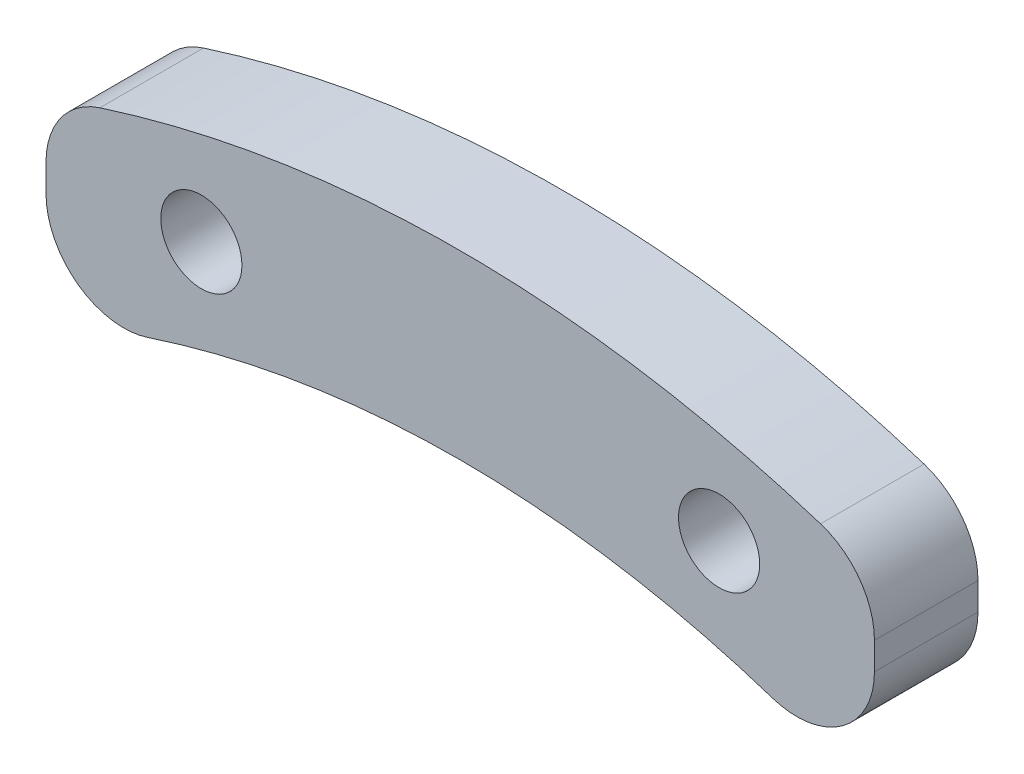
ISO-10303-21;
HEADER;
FILE_DESCRIPTION(('STEP AP214'),'2;1');
FILE_NAME('part.step','',(''),(''),'','','');
FILE_SCHEMA(('AUTOMOTIVE_DESIGN { 1 0 10303 214 1 1 1 1 }'));
ENDSEC;
DATA;
#1=APPLICATION_CONTEXT('core data for automotive mechanical design processes');
#2=APPLICATION_PROTOCOL_DEFINITION('international standard','automotive_design',2000,#1);
#3=PRODUCT_CONTEXT('',#1,'mechanical');
#4=PRODUCT('Part','Part','',(#3));
#5=PRODUCT_RELATED_PRODUCT_CATEGORY('part','',(#4));
#6=PRODUCT_DEFINITION_FORMATION('','',#4);
#7=PRODUCT_DEFINITION_CONTEXT('part definition',#1,'design');
#8=PRODUCT_DEFINITION('design','',#6,#7);
#9=PRODUCT_DEFINITION_SHAPE('','',#8);
#10=(LENGTH_UNIT() NAMED_UNIT(*) SI_UNIT(.MILLI.,.METRE.));
#11=(NAMED_UNIT(*) PLANE_ANGLE_UNIT() SI_UNIT($,.RADIAN.));
#12=(NAMED_UNIT(*) SI_UNIT($,.STERADIAN.) SOLID_ANGLE_UNIT());
#13=UNCERTAINTY_MEASURE_WITH_UNIT(LENGTH_MEASURE(1.E-05),#10,'distance_accuracy_value','');
#14=(GEOMETRIC_REPRESENTATION_CONTEXT(3) GLOBAL_UNCERTAINTY_ASSIGNED_CONTEXT((#13)) GLOBAL_UNIT_ASSIGNED_CONTEXT((#10,
#11,#12)) REPRESENTATION_CONTEXT('',''));
#15=CARTESIAN_POINT('',(0.,0.,0.));
#16=DIRECTION('',(0.,0.,1.));
#17=DIRECTION('',(1.,0.,0.));
#18=AXIS2_PLACEMENT_3D('',#15,#16,#17);
#19=CARTESIAN_POINT('',(0.,0.,3.175));
#20=DIRECTION('',(0.,0.,1.));
#21=DIRECTION('',(1.,0.,0.));
#22=AXIS2_PLACEMENT_3D('',#19,#20,#21);
#23=PLANE('',#22);
#24=CARTESIAN_POINT('',(15.875,64.7575478226284,3.175));
#25=DIRECTION('',(0.,0.,1.));
#26=DIRECTION('',(1.,0.,0.));
#27=AXIS2_PLACEMENT_3D('',#24,#25,#26);
#28=CIRCLE('',#27,2.4892);
#29=CARTESIAN_POINT('',(18.3642,64.7575478226284,3.175));
#30=VERTEX_POINT('',#29);
#31=EDGE_CURVE('E128',#30,#30,#28,.T.);
#32=ORIENTED_EDGE('',*,*,#31,.F.);
#33=EDGE_LOOP('',(#32));
#34=FACE_BOUND('',#33,.T.);
#35=DIRECTION('',(0.,-1.,0.));
#36=VECTOR('',#35,1.);
#37=CARTESIAN_POINT('',(-25.4,67.6179966914319,3.175));
#38=LINE('',#37,#36);
#39=CARTESIAN_POINT('',(-25.4,64.234926794638,3.175));
#40=VERTEX_POINT('',#39);
#41=CARTESIAN_POINT('',(-25.4,62.5654273166299,3.175));
#42=VERTEX_POINT('',#41);
#43=EDGE_CURVE('E137',#40,#42,#38,.T.);
#44=ORIENTED_EDGE('',*,*,#43,.T.);
#45=CARTESIAN_POINT('',(-20.6375,62.5654273166299,3.175));
#46=DIRECTION('',(0.,0.,1.));
#47=DIRECTION('',(1.,0.,0.));
#48=AXIS2_PLACEMENT_3D('',#45,#46,#47);
#49=CIRCLE('',#48,4.7625);
#50=CARTESIAN_POINT('',(-19.1456325301205,58.0426253419338,3.175));
#51=VERTEX_POINT('',#50);
#52=EDGE_CURVE('E155',#42,#51,#49,.T.);
#53=ORIENTED_EDGE('',*,*,#52,.T.);
#54=CARTESIAN_POINT('',(0.,0.,3.175));
#55=DIRECTION('',(0.,0.,-1.));
#56=DIRECTION('',(1.,0.,0.));
#57=AXIS2_PLACEMENT_3D('',#54,#55,#56);
#58=CIRCLE('',#57,61.11875);
#59=CARTESIAN_POINT('',(19.1456325301205,58.0426253419338,3.175));
#60=VERTEX_POINT('',#59);
#61=EDGE_CURVE('E119',#51,#60,#58,.T.);
#62=ORIENTED_EDGE('',*,*,#61,.T.);
#63=CARTESIAN_POINT('',(20.6375,62.5654273166299,3.175));
#64=DIRECTION('',(0.,0.,1.));
#65=DIRECTION('',(1.,0.,0.));
#66=AXIS2_PLACEMENT_3D('',#63,#64,#65);
#67=CIRCLE('',#66,4.7625);
#68=CARTESIAN_POINT('',(25.4,62.5654273166299,3.175));
#69=VERTEX_POINT('',#68);
#70=EDGE_CURVE('E152',#60,#69,#67,.T.);
#71=ORIENTED_EDGE('',*,*,#70,.T.);
#72=DIRECTION('',(0.,1.,0.));
#73=VECTOR('',#72,1.);
#74=CARTESIAN_POINT('',(25.4,67.6179966914319,3.175));
#75=LINE('',#74,#73);
#76=CARTESIAN_POINT('',(25.4,64.234926794638,3.175));
#77=VERTEX_POINT('',#76);
#78=EDGE_CURVE('E166',#69,#77,#75,.T.);
#79=ORIENTED_EDGE('',*,*,#78,.T.);
#80=CARTESIAN_POINT('',(20.6375,64.234926794638,3.175));
#81=DIRECTION('',(0.,0.,1.));
#82=DIRECTION('',(1.,0.,0.));
#83=AXIS2_PLACEMENT_3D('',#80,#81,#82);
#84=CIRCLE('',#83,4.7625);
#85=CARTESIAN_POINT('',(22.0942647058824,68.7691569213183,3.175));
#86=VERTEX_POINT('',#85);
#87=EDGE_CURVE('E55',#77,#86,#84,.T.);
#88=ORIENTED_EDGE('',*,*,#87,.T.);
#89=CARTESIAN_POINT('',(0.,0.,3.175));
#90=DIRECTION('',(0.,0.,1.));
#91=DIRECTION('',(1.,0.,0.));
#92=AXIS2_PLACEMENT_3D('',#89,#90,#91);
#93=CIRCLE('',#92,72.23125);
#94=CARTESIAN_POINT('',(-22.0942647058824,68.7691569213183,3.175));
#95=VERTEX_POINT('',#94);
#96=EDGE_CURVE('E174',#86,#95,#93,.T.);
#97=ORIENTED_EDGE('',*,*,#96,.T.);
#98=CARTESIAN_POINT('',(-20.6375,64.234926794638,3.175));
#99=DIRECTION('',(0.,0.,1.));
#100=DIRECTION('',(1.,0.,0.));
#101=AXIS2_PLACEMENT_3D('',#98,#99,#100);
#102=CIRCLE('',#101,4.7625);
#103=EDGE_CURVE('E150',#95,#40,#102,.T.);
#104=ORIENTED_EDGE('',*,*,#103,.T.);
#105=EDGE_LOOP('',(#44,#53,#62,#71,#79,#88,#97,#104));
#106=FACE_BOUND('',#105,.T.);
#107=CARTESIAN_POINT('',(-15.875,64.7575478226284,3.175));
#108=DIRECTION('',(0.,0.,1.));
#109=DIRECTION('',(1.,0.,0.));
#110=AXIS2_PLACEMENT_3D('',#107,#108,#109);
#111=CIRCLE('',#110,2.4892);
#112=CARTESIAN_POINT('',(-13.3858,64.7575478226284,3.175));
#113=VERTEX_POINT('',#112);
#114=EDGE_CURVE('E181',#113,#113,#111,.T.);
#115=ORIENTED_EDGE('',*,*,#114,.F.);
#116=EDGE_LOOP('',(#115));
#117=FACE_BOUND('',#116,.T.);
#118=ADVANCED_FACE('F33',(#34,#106,#117),#23,.T.);
#119=CARTESIAN_POINT('',(0.,0.,-3.175));
#120=DIRECTION('',(0.,0.,1.));
#121=DIRECTION('',(1.,0.,0.));
#122=AXIS2_PLACEMENT_3D('',#119,#120,#121);
#123=PLANE('',#122);
#124=CARTESIAN_POINT('',(0.,0.,-3.175));
#125=DIRECTION('',(0.,0.,-1.));
#126=DIRECTION('',(1.,0.,0.));
#127=AXIS2_PLACEMENT_3D('',#124,#125,#126);
#128=CIRCLE('',#127,61.11875);
#129=CARTESIAN_POINT('',(-19.1456325301205,58.0426253419338,-3.175));
#130=VERTEX_POINT('',#129);
#131=CARTESIAN_POINT('',(19.1456325301205,58.0426253419338,-3.175));
#132=VERTEX_POINT('',#131);
#133=EDGE_CURVE('E116',#130,#132,#128,.T.);
#134=ORIENTED_EDGE('',*,*,#133,.F.);
#135=CARTESIAN_POINT('',(-20.6375,62.5654273166299,-3.175));
#136=DIRECTION('',(0.,0.,1.));
#137=DIRECTION('',(1.,0.,0.));
#138=AXIS2_PLACEMENT_3D('',#135,#136,#137);
#139=CIRCLE('',#138,4.7625);
#140=CARTESIAN_POINT('',(-25.4,62.5654273166299,-3.175));
#141=VERTEX_POINT('',#140);
#142=EDGE_CURVE('E99',#130,#141,#139,.F.);
#143=ORIENTED_EDGE('',*,*,#142,.T.);
#144=DIRECTION('',(0.,-1.,0.));
#145=VECTOR('',#144,1.);
#146=CARTESIAN_POINT('',(-25.4,67.6179966914319,-3.175));
#147=LINE('',#146,#145);
#148=CARTESIAN_POINT('',(-25.4,64.234926794638,-3.175));
#149=VERTEX_POINT('',#148);
#150=EDGE_CURVE('E141',#149,#141,#147,.T.);
#151=ORIENTED_EDGE('',*,*,#150,.F.);
#152=CARTESIAN_POINT('',(-20.6375,64.234926794638,-3.175));
#153=DIRECTION('',(0.,0.,1.));
#154=DIRECTION('',(1.,0.,0.));
#155=AXIS2_PLACEMENT_3D('',#152,#153,#154);
#156=CIRCLE('',#155,4.7625);
#157=CARTESIAN_POINT('',(-22.0942647058824,68.7691569213183,-3.175));
#158=VERTEX_POINT('',#157);
#159=EDGE_CURVE('E120',#149,#158,#156,.F.);
#160=ORIENTED_EDGE('',*,*,#159,.T.);
#161=CARTESIAN_POINT('',(0.,0.,-3.175));
#162=DIRECTION('',(0.,0.,1.));
#163=DIRECTION('',(1.,0.,0.));
#164=AXIS2_PLACEMENT_3D('',#161,#162,#163);
#165=CIRCLE('',#164,72.23125);
#166=CARTESIAN_POINT('',(22.0942647058824,68.7691569213183,-3.175));
#167=VERTEX_POINT('',#166);
#168=EDGE_CURVE('E131',#167,#158,#165,.T.);
#169=ORIENTED_EDGE('',*,*,#168,.F.);
#170=CARTESIAN_POINT('',(20.6375,64.234926794638,-3.175));
#171=DIRECTION('',(0.,0.,1.));
#172=DIRECTION('',(1.,0.,0.));
#173=AXIS2_PLACEMENT_3D('',#170,#171,#172);
#174=CIRCLE('',#173,4.7625);
#175=CARTESIAN_POINT('',(25.4,64.234926794638,-3.175));
#176=VERTEX_POINT('',#175);
#177=EDGE_CURVE('E110',#167,#176,#174,.F.);
#178=ORIENTED_EDGE('',*,*,#177,.T.);
#179=DIRECTION('',(0.,1.,0.));
#180=VECTOR('',#179,1.);
#181=CARTESIAN_POINT('',(25.4,67.6179966914319,-3.175));
#182=LINE('',#181,#180);
#183=CARTESIAN_POINT('',(25.4,62.5654273166299,-3.175));
#184=VERTEX_POINT('',#183);
#185=EDGE_CURVE('E127',#184,#176,#182,.T.);
#186=ORIENTED_EDGE('',*,*,#185,.F.);
#187=CARTESIAN_POINT('',(20.6375,62.5654273166299,-3.175));
#188=DIRECTION('',(0.,0.,1.));
#189=DIRECTION('',(1.,0.,0.));
#190=AXIS2_PLACEMENT_3D('',#187,#188,#189);
#191=CIRCLE('',#190,4.7625);
#192=EDGE_CURVE('E126',#184,#132,#191,.F.);
#193=ORIENTED_EDGE('',*,*,#192,.T.);
#194=EDGE_LOOP('',(#134,#143,#151,#160,#169,#178,#186,#193));
#195=FACE_BOUND('',#194,.T.);
#196=CARTESIAN_POINT('',(15.875,64.7575478226284,-3.175));
#197=DIRECTION('',(0.,0.,1.));
#198=DIRECTION('',(1.,0.,0.));
#199=AXIS2_PLACEMENT_3D('',#196,#197,#198);
#200=CIRCLE('',#199,2.4892);
#201=CARTESIAN_POINT('',(18.3642,64.7575478226284,-3.175));
#202=VERTEX_POINT('',#201);
#203=EDGE_CURVE('E134',#202,#202,#200,.T.);
#204=ORIENTED_EDGE('',*,*,#203,.T.);
#205=EDGE_LOOP('',(#204));
#206=FACE_BOUND('',#205,.T.);
#207=CARTESIAN_POINT('',(-15.875,64.7575478226284,-3.175));
#208=DIRECTION('',(0.,0.,1.));
#209=DIRECTION('',(1.,0.,0.));
#210=AXIS2_PLACEMENT_3D('',#207,#208,#209);
#211=CIRCLE('',#210,2.4892);
#212=CARTESIAN_POINT('',(-13.3858,64.7575478226284,-3.175));
#213=VERTEX_POINT('',#212);
#214=EDGE_CURVE('E183',#213,#213,#211,.T.);
#215=ORIENTED_EDGE('',*,*,#214,.T.);
#216=EDGE_LOOP('',(#215));
#217=FACE_BOUND('',#216,.T.);
#218=ADVANCED_FACE('F123',(#195,#206,#217),#123,.F.);
#219=CARTESIAN_POINT('',(0.,0.,3.175));
#220=DIRECTION('',(0.,0.,-1.));
#221=DIRECTION('',(-1.,0.,0.));
#222=AXIS2_PLACEMENT_3D('',#219,#220,#221);
#223=CYLINDRICAL_SURFACE('',#222,61.11875);
#224=ORIENTED_EDGE('',*,*,#61,.F.);
#225=DIRECTION('',(0.,0.,-1.));
#226=VECTOR('',#225,1.);
#227=CARTESIAN_POINT('',(-19.1456325301205,58.0426253419338,3.175));
#228=LINE('',#227,#226);
#229=EDGE_CURVE('E103',#51,#130,#228,.T.);
#230=ORIENTED_EDGE('',*,*,#229,.T.);
#231=ORIENTED_EDGE('',*,*,#133,.T.);
#232=DIRECTION('',(0.,0.,-1.));
#233=VECTOR('',#232,1.);
#234=CARTESIAN_POINT('',(19.1456325301205,58.0426253419338,3.175));
#235=LINE('',#234,#233);
#236=EDGE_CURVE('E121',#132,#60,#235,.F.);
#237=ORIENTED_EDGE('',*,*,#236,.T.);
#238=EDGE_LOOP('',(#224,#230,#231,#237));
#239=FACE_BOUND('',#238,.T.);
#240=ADVANCED_FACE('F115',(#239),#223,.F.);
#241=CARTESIAN_POINT('',(25.4,67.6179966914319,3.175));
#242=DIRECTION('',(-1.,0.,0.));
#243=DIRECTION('',(0.,0.,1.));
#244=AXIS2_PLACEMENT_3D('',#241,#242,#243);
#245=PLANE('',#244);
#246=ORIENTED_EDGE('',*,*,#185,.T.);
#247=DIRECTION('',(0.,0.,-1.));
#248=VECTOR('',#247,1.);
#249=CARTESIAN_POINT('',(25.4,64.234926794638,3.175));
#250=LINE('',#249,#248);
#251=EDGE_CURVE('E11',#176,#77,#250,.F.);
#252=ORIENTED_EDGE('',*,*,#251,.T.);
#253=ORIENTED_EDGE('',*,*,#78,.F.);
#254=DIRECTION('',(0.,0.,-1.));
#255=VECTOR('',#254,1.);
#256=CARTESIAN_POINT('',(25.4,62.5654273166299,3.175));
#257=LINE('',#256,#255);
#258=EDGE_CURVE('E41',#69,#184,#257,.T.);
#259=ORIENTED_EDGE('',*,*,#258,.T.);
#260=EDGE_LOOP('',(#246,#252,#253,#259));
#261=FACE_BOUND('',#260,.T.);
#262=ADVANCED_FACE('F164',(#261),#245,.F.);
#263=CARTESIAN_POINT('',(0.,0.,3.175));
#264=DIRECTION('',(0.,0.,-1.));
#265=DIRECTION('',(-1.,0.,0.));
#266=AXIS2_PLACEMENT_3D('',#263,#264,#265);
#267=CYLINDRICAL_SURFACE('',#266,72.23125);
#268=ORIENTED_EDGE('',*,*,#96,.F.);
#269=DIRECTION('',(0.,0.,-1.));
#270=VECTOR('',#269,1.);
#271=CARTESIAN_POINT('',(22.0942647058824,68.7691569213183,3.175));
#272=LINE('',#271,#270);
#273=EDGE_CURVE('E158',#86,#167,#272,.T.);
#274=ORIENTED_EDGE('',*,*,#273,.T.);
#275=ORIENTED_EDGE('',*,*,#168,.T.);
#276=DIRECTION('',(0.,0.,-1.));
#277=VECTOR('',#276,1.);
#278=CARTESIAN_POINT('',(-22.0942647058824,68.7691569213183,3.175));
#279=LINE('',#278,#277);
#280=EDGE_CURVE('E48',#158,#95,#279,.F.);
#281=ORIENTED_EDGE('',*,*,#280,.T.);
#282=EDGE_LOOP('',(#268,#274,#275,#281));
#283=FACE_BOUND('',#282,.T.);
#284=ADVANCED_FACE('F173',(#283),#267,.T.);
#285=CARTESIAN_POINT('',(-25.4,67.6179966914319,3.175));
#286=DIRECTION('',(1.,0.,0.));
#287=DIRECTION('',(0.,0.,-1.));
#288=AXIS2_PLACEMENT_3D('',#285,#286,#287);
#289=PLANE('',#288);
#290=ORIENTED_EDGE('',*,*,#150,.T.);
#291=DIRECTION('',(0.,0.,-1.));
#292=VECTOR('',#291,1.);
#293=CARTESIAN_POINT('',(-25.4,62.5654273166299,3.175));
#294=LINE('',#293,#292);
#295=EDGE_CURVE('E104',#141,#42,#294,.F.);
#296=ORIENTED_EDGE('',*,*,#295,.T.);
#297=ORIENTED_EDGE('',*,*,#43,.F.);
#298=DIRECTION('',(0.,0.,-1.));
#299=VECTOR('',#298,1.);
#300=CARTESIAN_POINT('',(-25.4,64.234926794638,3.175));
#301=LINE('',#300,#299);
#302=EDGE_CURVE('E109',#40,#149,#301,.T.);
#303=ORIENTED_EDGE('',*,*,#302,.T.);
#304=EDGE_LOOP('',(#290,#296,#297,#303));
#305=FACE_BOUND('',#304,.T.);
#306=ADVANCED_FACE('F204',(#305),#289,.F.);
#307=CARTESIAN_POINT('',(15.875,64.7575478226284,3.175));
#308=DIRECTION('',(0.,0.,-1.));
#309=DIRECTION('',(-1.,0.,0.));
#310=AXIS2_PLACEMENT_3D('',#307,#308,#309);
#311=CYLINDRICAL_SURFACE('',#310,2.4892);
#312=ORIENTED_EDGE('',*,*,#31,.T.);
#313=EDGE_LOOP('',(#312));
#314=FACE_BOUND('',#313,.T.);
#315=ORIENTED_EDGE('',*,*,#203,.F.);
#316=EDGE_LOOP('',(#315));
#317=FACE_BOUND('',#316,.T.);
#318=ADVANCED_FACE('F201',(#314,#317),#311,.F.);
#319=CARTESIAN_POINT('',(-15.875,64.7575478226284,3.175));
#320=DIRECTION('',(0.,0.,-1.));
#321=DIRECTION('',(-1.,0.,0.));
#322=AXIS2_PLACEMENT_3D('',#319,#320,#321);
#323=CYLINDRICAL_SURFACE('',#322,2.4892);
#324=ORIENTED_EDGE('',*,*,#114,.T.);
#325=EDGE_LOOP('',(#324));
#326=FACE_BOUND('',#325,.T.);
#327=ORIENTED_EDGE('',*,*,#214,.F.);
#328=EDGE_LOOP('',(#327));
#329=FACE_BOUND('',#328,.T.);
#330=ADVANCED_FACE('F189',(#326,#329),#323,.F.);
#331=CARTESIAN_POINT('',(-20.6375,62.5654273166299,3.175));
#332=DIRECTION('',(0.,0.,-1.));
#333=DIRECTION('',(-1.,0.,0.));
#334=AXIS2_PLACEMENT_3D('',#331,#332,#333);
#335=CYLINDRICAL_SURFACE('',#334,4.7625);
#336=ORIENTED_EDGE('',*,*,#52,.F.);
#337=ORIENTED_EDGE('',*,*,#295,.F.);
#338=ORIENTED_EDGE('',*,*,#142,.F.);
#339=ORIENTED_EDGE('',*,*,#229,.F.);
#340=EDGE_LOOP('',(#336,#337,#338,#339));
#341=FACE_BOUND('',#340,.T.);
#342=ADVANCED_FACE('F102',(#341),#335,.T.);
#343=CARTESIAN_POINT('',(20.6375,64.234926794638,3.175));
#344=DIRECTION('',(0.,0.,-1.));
#345=DIRECTION('',(-1.,0.,0.));
#346=AXIS2_PLACEMENT_3D('',#343,#344,#345);
#347=CYLINDRICAL_SURFACE('',#346,4.7625);
#348=ORIENTED_EDGE('',*,*,#87,.F.);
#349=ORIENTED_EDGE('',*,*,#251,.F.);
#350=ORIENTED_EDGE('',*,*,#177,.F.);
#351=ORIENTED_EDGE('',*,*,#273,.F.);
#352=EDGE_LOOP('',(#348,#349,#350,#351));
#353=FACE_BOUND('',#352,.T.);
#354=ADVANCED_FACE('F172',(#353),#347,.T.);
#355=CARTESIAN_POINT('',(20.6375,62.5654273166299,3.175));
#356=DIRECTION('',(0.,0.,-1.));
#357=DIRECTION('',(-1.,0.,0.));
#358=AXIS2_PLACEMENT_3D('',#355,#356,#357);
#359=CYLINDRICAL_SURFACE('',#358,4.7625);
#360=ORIENTED_EDGE('',*,*,#70,.F.);
#361=ORIENTED_EDGE('',*,*,#236,.F.);
#362=ORIENTED_EDGE('',*,*,#192,.F.);
#363=ORIENTED_EDGE('',*,*,#258,.F.);
#364=EDGE_LOOP('',(#360,#361,#362,#363));
#365=FACE_BOUND('',#364,.T.);
#366=ADVANCED_FACE('F217',(#365),#359,.T.);
#367=CARTESIAN_POINT('',(-20.6375,64.234926794638,3.175));
#368=DIRECTION('',(0.,0.,-1.));
#369=DIRECTION('',(-1.,0.,0.));
#370=AXIS2_PLACEMENT_3D('',#367,#368,#369);
#371=CYLINDRICAL_SURFACE('',#370,4.7625);
#372=ORIENTED_EDGE('',*,*,#103,.F.);
#373=ORIENTED_EDGE('',*,*,#280,.F.);
#374=ORIENTED_EDGE('',*,*,#159,.F.);
#375=ORIENTED_EDGE('',*,*,#302,.F.);
#376=EDGE_LOOP('',(#372,#373,#374,#375));
#377=FACE_BOUND('',#376,.T.);
#378=ADVANCED_FACE('F35',(#377),#371,.T.);
#379=CLOSED_SHELL('',(#118,#218,#240,#262,#284,#306,#318,#330,#342,#354,#366,#378));
#380=MANIFOLD_SOLID_BREP('B2',#379);
#381=ADVANCED_BREP_SHAPE_REPRESENTATION('',(#18,#380),#14);
#382=SHAPE_DEFINITION_REPRESENTATION(#9,#381);
ENDSEC;
END-ISO-10303-21;
